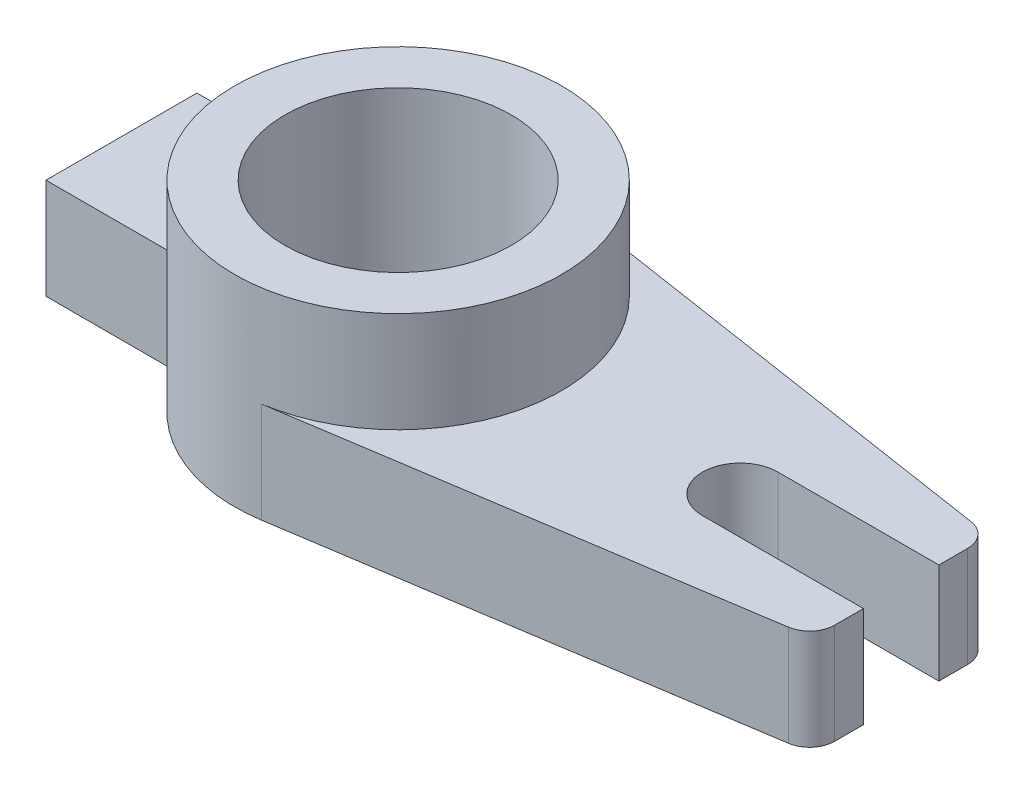
ISO-10303-21;
HEADER;
FILE_DESCRIPTION(('STEP AP214'),'2;1');
FILE_NAME('part.step','',(''),(''),'','','');
FILE_SCHEMA(('AUTOMOTIVE_DESIGN { 1 0 10303 214 1 1 1 1 }'));
ENDSEC;
DATA;
#1=APPLICATION_CONTEXT('core data for automotive mechanical design processes');
#2=APPLICATION_PROTOCOL_DEFINITION('international standard','automotive_design',2000,#1);
#3=PRODUCT_CONTEXT('',#1,'mechanical');
#4=PRODUCT('Part','Part','',(#3));
#5=PRODUCT_RELATED_PRODUCT_CATEGORY('part','',(#4));
#6=PRODUCT_DEFINITION_FORMATION('','',#4);
#7=PRODUCT_DEFINITION_CONTEXT('part definition',#1,'design');
#8=PRODUCT_DEFINITION('design','',#6,#7);
#9=PRODUCT_DEFINITION_SHAPE('','',#8);
#10=(LENGTH_UNIT() NAMED_UNIT(*) SI_UNIT(.MILLI.,.METRE.));
#11=(NAMED_UNIT(*) PLANE_ANGLE_UNIT() SI_UNIT($,.RADIAN.));
#12=(NAMED_UNIT(*) SI_UNIT($,.STERADIAN.) SOLID_ANGLE_UNIT());
#13=UNCERTAINTY_MEASURE_WITH_UNIT(LENGTH_MEASURE(1.E-05),#10,'distance_accuracy_value','');
#14=(GEOMETRIC_REPRESENTATION_CONTEXT(3) GLOBAL_UNCERTAINTY_ASSIGNED_CONTEXT((#13)) GLOBAL_UNIT_ASSIGNED_CONTEXT((#10,
#11,#12)) REPRESENTATION_CONTEXT('',''));
#15=CARTESIAN_POINT('',(0.,0.,0.));
#16=DIRECTION('',(0.,0.,1.));
#17=DIRECTION('',(1.,0.,0.));
#18=AXIS2_PLACEMENT_3D('',#15,#16,#17);
#19=CARTESIAN_POINT('',(0.,20.,0.));
#20=DIRECTION('',(0.,1.,0.));
#21=DIRECTION('',(0.,0.,1.));
#22=AXIS2_PLACEMENT_3D('',#19,#20,#21);
#23=PLANE('',#22);
#24=DIRECTION('',(1.,0.,0.));
#25=VECTOR('',#24,1.);
#26=CARTESIAN_POINT('',(0.,20.,15.));
#27=LINE('',#26,#25);
#28=CARTESIAN_POINT('',(-55.,20.,15.));
#29=VERTEX_POINT('',#28);
#30=CARTESIAN_POINT('',(-28.831406486677,20.,15.));
#31=VERTEX_POINT('',#30);
#32=EDGE_CURVE('E164',#29,#31,#27,.T.);
#33=ORIENTED_EDGE('',*,*,#32,.T.);
#34=CARTESIAN_POINT('',(0.,20.,0.));
#35=DIRECTION('',(0.,1.,0.));
#36=DIRECTION('',(0.,0.,1.));
#37=AXIS2_PLACEMENT_3D('',#34,#35,#36);
#38=CIRCLE('',#37,32.5);
#39=CARTESIAN_POINT('',(-28.831406486677,20.,-15.));
#40=VERTEX_POINT('',#39);
#41=EDGE_CURVE('E11',#31,#40,#38,.F.);
#42=ORIENTED_EDGE('',*,*,#41,.T.);
#43=DIRECTION('',(1.,0.,0.));
#44=VECTOR('',#43,1.);
#45=CARTESIAN_POINT('',(0.,20.,-15.));
#46=LINE('',#45,#44);
#47=CARTESIAN_POINT('',(-55.,20.,-15.));
#48=VERTEX_POINT('',#47);
#49=EDGE_CURVE('E270',#48,#40,#46,.T.);
#50=ORIENTED_EDGE('',*,*,#49,.F.);
#51=DIRECTION('',(0.,0.,-1.));
#52=VECTOR('',#51,1.);
#53=CARTESIAN_POINT('',(-55.,20.,0.));
#54=LINE('',#53,#52);
#55=EDGE_CURVE('E269',#29,#48,#54,.T.);
#56=ORIENTED_EDGE('',*,*,#55,.F.);
#57=EDGE_LOOP('',(#33,#42,#50,#56));
#58=FACE_BOUND('',#57,.T.);
#59=ADVANCED_FACE('F43',(#58),#23,.T.);
#60=DIRECTION('',(-0.988375212209647,0.,-0.152034337863312));
#61=VECTOR('',#60,1.);
#62=CARTESIAN_POINT('',(4.94111598055764,20.,-32.1221943968135));
#63=LINE('',#62,#61);
#64=CARTESIAN_POINT('',(95.7601716893166,20.,-18.1521809550725));
#65=VERTEX_POINT('',#64);
#66=CARTESIAN_POINT('',(4.94111598055764,20.,-32.1221943968135));
#67=VERTEX_POINT('',#66);
#68=EDGE_CURVE('E261',#65,#67,#63,.T.);
#69=ORIENTED_EDGE('',*,*,#68,.T.);
#70=CARTESIAN_POINT('',(4.94111598055763,20.,32.1221943968135));
#71=VERTEX_POINT('',#70);
#72=EDGE_CURVE('E50',#67,#71,#38,.F.);
#73=ORIENTED_EDGE('',*,*,#72,.T.);
#74=DIRECTION('',(-0.988375212209647,0.,0.152034337863312));
#75=VECTOR('',#74,1.);
#76=CARTESIAN_POINT('',(4.94111598055764,20.,32.1221943968135));
#77=LINE('',#76,#75);
#78=CARTESIAN_POINT('',(95.7601716893166,20.,18.1521809550725));
#79=VERTEX_POINT('',#78);
#80=EDGE_CURVE('E149',#79,#71,#77,.T.);
#81=ORIENTED_EDGE('',*,*,#80,.F.);
#82=CARTESIAN_POINT('',(95.,20.,13.2103048940243));
#83=DIRECTION('',(0.,1.,0.));
#84=DIRECTION('',(0.,0.,1.));
#85=AXIS2_PLACEMENT_3D('',#82,#83,#84);
#86=CIRCLE('',#85,5.);
#87=CARTESIAN_POINT('',(100.,20.,13.2103048940243));
#88=VERTEX_POINT('',#87);
#89=EDGE_CURVE('E162',#88,#79,#86,.F.);
#90=ORIENTED_EDGE('',*,*,#89,.F.);
#91=DIRECTION('',(0.,0.,1.));
#92=VECTOR('',#91,1.);
#93=CARTESIAN_POINT('',(100.,20.,0.));
#94=LINE('',#93,#92);
#95=CARTESIAN_POINT('',(100.,20.,7.5));
#96=VERTEX_POINT('',#95);
#97=EDGE_CURVE('E169',#96,#88,#94,.T.);
#98=ORIENTED_EDGE('',*,*,#97,.F.);
#99=DIRECTION('',(1.,0.,0.));
#100=VECTOR('',#99,1.);
#101=CARTESIAN_POINT('',(0.,20.,7.5));
#102=LINE('',#101,#100);
#103=CARTESIAN_POINT('',(68.,20.,7.5));
#104=VERTEX_POINT('',#103);
#105=EDGE_CURVE('E209',#104,#96,#102,.T.);
#106=ORIENTED_EDGE('',*,*,#105,.F.);
#107=CARTESIAN_POINT('',(68.,20.,0.));
#108=DIRECTION('',(0.,1.,0.));
#109=DIRECTION('',(0.,0.,1.));
#110=AXIS2_PLACEMENT_3D('',#107,#108,#109);
#111=CIRCLE('',#110,7.5);
#112=CARTESIAN_POINT('',(68.,20.,-7.5));
#113=VERTEX_POINT('',#112);
#114=EDGE_CURVE('E241',#113,#104,#111,.T.);
#115=ORIENTED_EDGE('',*,*,#114,.F.);
#116=DIRECTION('',(1.,0.,0.));
#117=VECTOR('',#116,1.);
#118=CARTESIAN_POINT('',(0.,20.,-7.5));
#119=LINE('',#118,#117);
#120=CARTESIAN_POINT('',(100.,20.,-7.5));
#121=VERTEX_POINT('',#120);
#122=EDGE_CURVE('E259',#113,#121,#119,.T.);
#123=ORIENTED_EDGE('',*,*,#122,.T.);
#124=DIRECTION('',(0.,0.,-1.));
#125=VECTOR('',#124,1.);
#126=CARTESIAN_POINT('',(100.,20.,0.));
#127=LINE('',#126,#125);
#128=CARTESIAN_POINT('',(100.,20.,-13.2103048940243));
#129=VERTEX_POINT('',#128);
#130=EDGE_CURVE('E258',#121,#129,#127,.T.);
#131=ORIENTED_EDGE('',*,*,#130,.T.);
#132=CARTESIAN_POINT('',(95.,20.,-13.2103048940243));
#133=DIRECTION('',(0.,1.,0.));
#134=DIRECTION('',(0.,0.,1.));
#135=AXIS2_PLACEMENT_3D('',#132,#133,#134);
#136=CIRCLE('',#135,5.);
#137=EDGE_CURVE('E256',#129,#65,#136,.T.);
#138=ORIENTED_EDGE('',*,*,#137,.T.);
#139=EDGE_LOOP('',(#69,#73,#81,#90,#98,#106,#115,#123,#131,#138));
#140=FACE_BOUND('',#139,.T.);
#141=ADVANCED_FACE('F161',(#140),#23,.T.);
#142=CARTESIAN_POINT('',(0.,20.,7.5));
#143=DIRECTION('',(0.,0.,-1.));
#144=DIRECTION('',(-1.,0.,0.));
#145=AXIS2_PLACEMENT_3D('',#142,#143,#144);
#146=PLANE('',#145);
#147=DIRECTION('',(1.,0.,0.));
#148=VECTOR('',#147,1.);
#149=CARTESIAN_POINT('',(0.,0.,7.5));
#150=LINE('',#149,#148);
#151=CARTESIAN_POINT('',(68.,0.,7.5));
#152=VERTEX_POINT('',#151);
#153=CARTESIAN_POINT('',(100.,0.,7.5));
#154=VERTEX_POINT('',#153);
#155=EDGE_CURVE('E174',#152,#154,#150,.T.);
#156=ORIENTED_EDGE('',*,*,#155,.F.);
#157=DIRECTION('',(0.,-1.,0.));
#158=VECTOR('',#157,1.);
#159=CARTESIAN_POINT('',(68.,20.,7.5));
#160=LINE('',#159,#158);
#161=EDGE_CURVE('E111',#104,#152,#160,.T.);
#162=ORIENTED_EDGE('',*,*,#161,.F.);
#163=ORIENTED_EDGE('',*,*,#105,.T.);
#164=DIRECTION('',(0.,-1.,0.));
#165=VECTOR('',#164,1.);
#166=CARTESIAN_POINT('',(100.,20.,7.5));
#167=LINE('',#166,#165);
#168=EDGE_CURVE('E58',#96,#154,#167,.T.);
#169=ORIENTED_EDGE('',*,*,#168,.T.);
#170=EDGE_LOOP('',(#156,#162,#163,#169));
#171=FACE_BOUND('',#170,.T.);
#172=ADVANCED_FACE('F44',(#171),#146,.T.);
#173=CARTESIAN_POINT('',(68.,20.,0.));
#174=DIRECTION('',(0.,-1.,0.));
#175=DIRECTION('',(0.,0.,-1.));
#176=AXIS2_PLACEMENT_3D('',#173,#174,#175);
#177=CYLINDRICAL_SURFACE('',#176,7.5);
#178=CARTESIAN_POINT('',(68.,0.,0.));
#179=DIRECTION('',(0.,1.,0.));
#180=DIRECTION('',(0.,0.,1.));
#181=AXIS2_PLACEMENT_3D('',#178,#179,#180);
#182=CIRCLE('',#181,7.5);
#183=CARTESIAN_POINT('',(68.,0.,-7.5));
#184=VERTEX_POINT('',#183);
#185=EDGE_CURVE('E175',#184,#152,#182,.T.);
#186=ORIENTED_EDGE('',*,*,#185,.F.);
#187=DIRECTION('',(0.,-1.,0.));
#188=VECTOR('',#187,1.);
#189=CARTESIAN_POINT('',(68.,20.,-7.5));
#190=LINE('',#189,#188);
#191=EDGE_CURVE('E233',#113,#184,#190,.T.);
#192=ORIENTED_EDGE('',*,*,#191,.F.);
#193=ORIENTED_EDGE('',*,*,#114,.T.);
#194=ORIENTED_EDGE('',*,*,#161,.T.);
#195=EDGE_LOOP('',(#186,#192,#193,#194));
#196=FACE_BOUND('',#195,.T.);
#197=ADVANCED_FACE('F239',(#196),#177,.F.);
#198=CARTESIAN_POINT('',(0.,20.,-7.5));
#199=DIRECTION('',(0.,0.,-1.));
#200=DIRECTION('',(-1.,0.,0.));
#201=AXIS2_PLACEMENT_3D('',#198,#199,#200);
#202=PLANE('',#201);
#203=DIRECTION('',(1.,0.,0.));
#204=VECTOR('',#203,1.);
#205=CARTESIAN_POINT('',(0.,0.,-7.5));
#206=LINE('',#205,#204);
#207=CARTESIAN_POINT('',(100.,0.,-7.5));
#208=VERTEX_POINT('',#207);
#209=EDGE_CURVE('E176',#184,#208,#206,.T.);
#210=ORIENTED_EDGE('',*,*,#209,.T.);
#211=DIRECTION('',(0.,-1.,0.));
#212=VECTOR('',#211,1.);
#213=CARTESIAN_POINT('',(100.,20.,-7.5));
#214=LINE('',#213,#212);
#215=EDGE_CURVE('E235',#121,#208,#214,.T.);
#216=ORIENTED_EDGE('',*,*,#215,.F.);
#217=ORIENTED_EDGE('',*,*,#122,.F.);
#218=ORIENTED_EDGE('',*,*,#191,.T.);
#219=EDGE_LOOP('',(#210,#216,#217,#218));
#220=FACE_BOUND('',#219,.T.);
#221=ADVANCED_FACE('F248',(#220),#202,.F.);
#222=CARTESIAN_POINT('',(100.,20.,0.));
#223=DIRECTION('',(-1.,0.,0.));
#224=DIRECTION('',(0.,0.,1.));
#225=AXIS2_PLACEMENT_3D('',#222,#223,#224);
#226=PLANE('',#225);
#227=DIRECTION('',(0.,0.,-1.));
#228=VECTOR('',#227,1.);
#229=CARTESIAN_POINT('',(100.,0.,0.));
#230=LINE('',#229,#228);
#231=CARTESIAN_POINT('',(100.,0.,-13.2103048940243));
#232=VERTEX_POINT('',#231);
#233=EDGE_CURVE('E182',#208,#232,#230,.T.);
#234=ORIENTED_EDGE('',*,*,#233,.T.);
#235=DIRECTION('',(0.,-1.,0.));
#236=VECTOR('',#235,1.);
#237=CARTESIAN_POINT('',(100.,20.,-13.2103048940243));
#238=LINE('',#237,#236);
#239=EDGE_CURVE('E228',#129,#232,#238,.T.);
#240=ORIENTED_EDGE('',*,*,#239,.F.);
#241=ORIENTED_EDGE('',*,*,#130,.F.);
#242=ORIENTED_EDGE('',*,*,#215,.T.);
#243=EDGE_LOOP('',(#234,#240,#241,#242));
#244=FACE_BOUND('',#243,.T.);
#245=ADVANCED_FACE('F255',(#244),#226,.F.);
#246=CARTESIAN_POINT('',(95.,20.,-13.2103048940243));
#247=DIRECTION('',(0.,-1.,0.));
#248=DIRECTION('',(0.,0.,-1.));
#249=AXIS2_PLACEMENT_3D('',#246,#247,#248);
#250=CYLINDRICAL_SURFACE('',#249,5.);
#251=CARTESIAN_POINT('',(95.,0.,-13.2103048940243));
#252=DIRECTION('',(0.,1.,0.));
#253=DIRECTION('',(0.,0.,1.));
#254=AXIS2_PLACEMENT_3D('',#251,#252,#253);
#255=CIRCLE('',#254,5.);
#256=CARTESIAN_POINT('',(95.7601716893166,0.,-18.1521809550725));
#257=VERTEX_POINT('',#256);
#258=EDGE_CURVE('E181',#232,#257,#255,.T.);
#259=ORIENTED_EDGE('',*,*,#258,.T.);
#260=DIRECTION('',(0.,-1.,0.));
#261=VECTOR('',#260,1.);
#262=CARTESIAN_POINT('',(95.7601716893166,20.,-18.1521809550725));
#263=LINE('',#262,#261);
#264=EDGE_CURVE('E226',#65,#257,#263,.T.);
#265=ORIENTED_EDGE('',*,*,#264,.F.);
#266=ORIENTED_EDGE('',*,*,#137,.F.);
#267=ORIENTED_EDGE('',*,*,#239,.T.);
#268=EDGE_LOOP('',(#259,#265,#266,#267));
#269=FACE_BOUND('',#268,.T.);
#270=ADVANCED_FACE('F300',(#269),#250,.T.);
#271=CARTESIAN_POINT('',(4.94111598055764,20.,-32.1221943968135));
#272=DIRECTION('',(-0.152034337863312,0.,0.988375212209647));
#273=DIRECTION('',(0.988375212209647,0.,0.152034337863312));
#274=AXIS2_PLACEMENT_3D('',#271,#272,#273);
#275=PLANE('',#274);
#276=DIRECTION('',(-0.988375212209647,0.,-0.152034337863312));
#277=VECTOR('',#276,1.);
#278=CARTESIAN_POINT('',(4.94111598055764,0.,-32.1221943968135));
#279=LINE('',#278,#277);
#280=CARTESIAN_POINT('',(4.94111598055764,0.,-32.1221943968135));
#281=VERTEX_POINT('',#280);
#282=EDGE_CURVE('E183',#257,#281,#279,.T.);
#283=ORIENTED_EDGE('',*,*,#282,.T.);
#284=DIRECTION('',(0.,-1.,0.));
#285=VECTOR('',#284,1.);
#286=CARTESIAN_POINT('',(4.94111598055764,20.,-32.1221943968135));
#287=LINE('',#286,#285);
#288=EDGE_CURVE('E224',#67,#281,#287,.T.);
#289=ORIENTED_EDGE('',*,*,#288,.F.);
#290=ORIENTED_EDGE('',*,*,#68,.F.);
#291=ORIENTED_EDGE('',*,*,#264,.T.);
#292=EDGE_LOOP('',(#283,#289,#290,#291));
#293=FACE_BOUND('',#292,.T.);
#294=ADVANCED_FACE('F297',(#293),#275,.F.);
#295=CARTESIAN_POINT('',(0.,20.,-15.));
#296=DIRECTION('',(0.,0.,-1.));
#297=DIRECTION('',(-1.,0.,0.));
#298=AXIS2_PLACEMENT_3D('',#295,#296,#297);
#299=PLANE('',#298);
#300=DIRECTION('',(1.,0.,0.));
#301=VECTOR('',#300,1.);
#302=CARTESIAN_POINT('',(0.,0.,-15.));
#303=LINE('',#302,#301);
#304=CARTESIAN_POINT('',(-55.,0.,-15.));
#305=VERTEX_POINT('',#304);
#306=CARTESIAN_POINT('',(-28.831406486677,0.,-15.));
#307=VERTEX_POINT('',#306);
#308=EDGE_CURVE('E190',#305,#307,#303,.T.);
#309=ORIENTED_EDGE('',*,*,#308,.F.);
#310=DIRECTION('',(0.,-1.,0.));
#311=VECTOR('',#310,1.);
#312=CARTESIAN_POINT('',(-55.,20.,-15.));
#313=LINE('',#312,#311);
#314=EDGE_CURVE('E218',#48,#305,#313,.T.);
#315=ORIENTED_EDGE('',*,*,#314,.F.);
#316=ORIENTED_EDGE('',*,*,#49,.T.);
#317=DIRECTION('',(0.,-1.,0.));
#318=VECTOR('',#317,1.);
#319=CARTESIAN_POINT('',(-28.831406486677,20.,-15.));
#320=LINE('',#319,#318);
#321=EDGE_CURVE('E222',#40,#307,#320,.T.);
#322=ORIENTED_EDGE('',*,*,#321,.T.);
#323=EDGE_LOOP('',(#309,#315,#316,#322));
#324=FACE_BOUND('',#323,.T.);
#325=ADVANCED_FACE('F286',(#324),#299,.T.);
#326=CARTESIAN_POINT('',(-55.,20.,0.));
#327=DIRECTION('',(-1.,0.,0.));
#328=DIRECTION('',(0.,0.,1.));
#329=AXIS2_PLACEMENT_3D('',#326,#327,#328);
#330=PLANE('',#329);
#331=DIRECTION('',(0.,0.,-1.));
#332=VECTOR('',#331,1.);
#333=CARTESIAN_POINT('',(-55.,0.,0.));
#334=LINE('',#333,#332);
#335=CARTESIAN_POINT('',(-55.,0.,15.));
#336=VERTEX_POINT('',#335);
#337=EDGE_CURVE('E194',#336,#305,#334,.T.);
#338=ORIENTED_EDGE('',*,*,#337,.F.);
#339=DIRECTION('',(0.,-1.,0.));
#340=VECTOR('',#339,1.);
#341=CARTESIAN_POINT('',(-55.,20.,15.));
#342=LINE('',#341,#340);
#343=EDGE_CURVE('E220',#29,#336,#342,.T.);
#344=ORIENTED_EDGE('',*,*,#343,.F.);
#345=ORIENTED_EDGE('',*,*,#55,.T.);
#346=ORIENTED_EDGE('',*,*,#314,.T.);
#347=EDGE_LOOP('',(#338,#344,#345,#346));
#348=FACE_BOUND('',#347,.T.);
#349=ADVANCED_FACE('F295',(#348),#330,.T.);
#350=CARTESIAN_POINT('',(0.,20.,15.));
#351=DIRECTION('',(0.,0.,-1.));
#352=DIRECTION('',(-1.,0.,0.));
#353=AXIS2_PLACEMENT_3D('',#350,#351,#352);
#354=PLANE('',#353);
#355=DIRECTION('',(1.,0.,0.));
#356=VECTOR('',#355,1.);
#357=CARTESIAN_POINT('',(0.,0.,15.));
#358=LINE('',#357,#356);
#359=CARTESIAN_POINT('',(-28.831406486677,0.,15.));
#360=VERTEX_POINT('',#359);
#361=EDGE_CURVE('E198',#336,#360,#358,.T.);
#362=ORIENTED_EDGE('',*,*,#361,.T.);
#363=DIRECTION('',(0.,-1.,0.));
#364=VECTOR('',#363,1.);
#365=CARTESIAN_POINT('',(-28.831406486677,20.,15.));
#366=LINE('',#365,#364);
#367=EDGE_CURVE('E212',#31,#360,#366,.T.);
#368=ORIENTED_EDGE('',*,*,#367,.F.);
#369=ORIENTED_EDGE('',*,*,#32,.F.);
#370=ORIENTED_EDGE('',*,*,#343,.T.);
#371=EDGE_LOOP('',(#362,#368,#369,#370));
#372=FACE_BOUND('',#371,.T.);
#373=ADVANCED_FACE('F278',(#372),#354,.F.);
#374=CARTESIAN_POINT('',(0.,20.,0.));
#375=DIRECTION('',(0.,-1.,0.));
#376=DIRECTION('',(0.,0.,-1.));
#377=AXIS2_PLACEMENT_3D('',#374,#375,#376);
#378=CYLINDRICAL_SURFACE('',#377,32.5);
#379=CARTESIAN_POINT('',(0.,0.,0.));
#380=DIRECTION('',(0.,1.,0.));
#381=DIRECTION('',(0.,0.,1.));
#382=AXIS2_PLACEMENT_3D('',#379,#380,#381);
#383=CIRCLE('',#382,32.5);
#384=CARTESIAN_POINT('',(4.94111598055764,0.,32.1221943968135));
#385=VERTEX_POINT('',#384);
#386=EDGE_CURVE('E196',#360,#385,#383,.T.);
#387=ORIENTED_EDGE('',*,*,#386,.T.);
#388=DIRECTION('',(0.,-1.,0.));
#389=VECTOR('',#388,1.);
#390=CARTESIAN_POINT('',(4.94111598055764,20.,32.1221943968135));
#391=LINE('',#390,#389);
#392=EDGE_CURVE('E156',#71,#385,#391,.T.);
#393=ORIENTED_EDGE('',*,*,#392,.F.);
#394=ORIENTED_EDGE('',*,*,#72,.F.);
#395=ORIENTED_EDGE('',*,*,#288,.T.);
#396=CARTESIAN_POINT('',(0.,0.,0.));
#397=DIRECTION('',(0.,1.,0.));
#398=DIRECTION('',(0.,0.,1.));
#399=AXIS2_PLACEMENT_3D('',#396,#397,#398);
#400=CIRCLE('',#399,32.5);
#401=EDGE_CURVE('E187',#281,#307,#400,.T.);
#402=ORIENTED_EDGE('',*,*,#401,.T.);
#403=ORIENTED_EDGE('',*,*,#321,.F.);
#404=ORIENTED_EDGE('',*,*,#41,.F.);
#405=ORIENTED_EDGE('',*,*,#367,.T.);
#406=EDGE_LOOP('',(#387,#393,#394,#395,#402,#403,#404,#405));
#407=FACE_BOUND('',#406,.T.);
#408=CARTESIAN_POINT('',(0.,40.,0.));
#409=DIRECTION('',(0.,1.,0.));
#410=DIRECTION('',(0.,0.,1.));
#411=AXIS2_PLACEMENT_3D('',#408,#409,#410);
#412=CIRCLE('',#411,32.5);
#413=CARTESIAN_POINT('',(0.,40.,32.5));
#414=VERTEX_POINT('',#413);
#415=EDGE_CURVE('E177',#414,#414,#412,.T.);
#416=ORIENTED_EDGE('',*,*,#415,.F.);
#417=EDGE_LOOP('',(#416));
#418=FACE_BOUND('',#417,.T.);
#419=ADVANCED_FACE('F283',(#407,#418),#378,.T.);
#420=CARTESIAN_POINT('',(4.94111598055764,20.,32.1221943968135));
#421=DIRECTION('',(0.152034337863312,0.,0.988375212209647));
#422=DIRECTION('',(0.988375212209647,0.,-0.152034337863312));
#423=AXIS2_PLACEMENT_3D('',#420,#421,#422);
#424=PLANE('',#423);
#425=DIRECTION('',(-0.988375212209647,0.,0.152034337863312));
#426=VECTOR('',#425,1.);
#427=CARTESIAN_POINT('',(4.94111598055764,0.,32.1221943968135));
#428=LINE('',#427,#426);
#429=CARTESIAN_POINT('',(95.7601716893166,0.,18.1521809550725));
#430=VERTEX_POINT('',#429);
#431=EDGE_CURVE('E155',#430,#385,#428,.T.);
#432=ORIENTED_EDGE('',*,*,#431,.F.);
#433=DIRECTION('',(0.,-1.,0.));
#434=VECTOR('',#433,1.);
#435=CARTESIAN_POINT('',(95.7601716893166,20.,18.1521809550725));
#436=LINE('',#435,#434);
#437=EDGE_CURVE('E148',#79,#430,#436,.T.);
#438=ORIENTED_EDGE('',*,*,#437,.F.);
#439=ORIENTED_EDGE('',*,*,#80,.T.);
#440=ORIENTED_EDGE('',*,*,#392,.T.);
#441=EDGE_LOOP('',(#432,#438,#439,#440));
#442=FACE_BOUND('',#441,.T.);
#443=ADVANCED_FACE('F146',(#442),#424,.T.);
#444=CARTESIAN_POINT('',(95.,20.,13.2103048940243));
#445=DIRECTION('',(0.,-1.,0.));
#446=DIRECTION('',(0.,0.,-1.));
#447=AXIS2_PLACEMENT_3D('',#444,#445,#446);
#448=CYLINDRICAL_SURFACE('',#447,5.);
#449=CARTESIAN_POINT('',(95.,0.,13.2103048940243));
#450=DIRECTION('',(0.,1.,0.));
#451=DIRECTION('',(0.,0.,1.));
#452=AXIS2_PLACEMENT_3D('',#449,#450,#451);
#453=CIRCLE('',#452,5.);
#454=CARTESIAN_POINT('',(100.,0.,13.2103048940243));
#455=VERTEX_POINT('',#454);
#456=EDGE_CURVE('E205',#455,#430,#453,.F.);
#457=ORIENTED_EDGE('',*,*,#456,.F.);
#458=DIRECTION('',(0.,-1.,0.));
#459=VECTOR('',#458,1.);
#460=CARTESIAN_POINT('',(100.,20.,13.2103048940243));
#461=LINE('',#460,#459);
#462=EDGE_CURVE('E104',#88,#455,#461,.T.);
#463=ORIENTED_EDGE('',*,*,#462,.F.);
#464=ORIENTED_EDGE('',*,*,#89,.T.);
#465=ORIENTED_EDGE('',*,*,#437,.T.);
#466=EDGE_LOOP('',(#457,#463,#464,#465));
#467=FACE_BOUND('',#466,.T.);
#468=ADVANCED_FACE('F170',(#467),#448,.T.);
#469=CARTESIAN_POINT('',(100.,20.,0.));
#470=DIRECTION('',(1.,0.,0.));
#471=DIRECTION('',(0.,0.,-1.));
#472=AXIS2_PLACEMENT_3D('',#469,#470,#471);
#473=PLANE('',#472);
#474=DIRECTION('',(0.,0.,1.));
#475=VECTOR('',#474,1.);
#476=CARTESIAN_POINT('',(100.,0.,0.));
#477=LINE('',#476,#475);
#478=EDGE_CURVE('E204',#154,#455,#477,.T.);
#479=ORIENTED_EDGE('',*,*,#478,.F.);
#480=ORIENTED_EDGE('',*,*,#168,.F.);
#481=ORIENTED_EDGE('',*,*,#97,.T.);
#482=ORIENTED_EDGE('',*,*,#462,.T.);
#483=EDGE_LOOP('',(#479,#480,#481,#482));
#484=FACE_BOUND('',#483,.T.);
#485=ADVANCED_FACE('F322',(#484),#473,.T.);
#486=CARTESIAN_POINT('',(0.,20.,0.));
#487=DIRECTION('',(0.,-1.,0.));
#488=DIRECTION('',(0.,0.,-1.));
#489=AXIS2_PLACEMENT_3D('',#486,#487,#488);
#490=CYLINDRICAL_SURFACE('',#489,22.5);
#491=CARTESIAN_POINT('',(0.,0.,0.));
#492=DIRECTION('',(0.,1.,0.));
#493=DIRECTION('',(0.,0.,1.));
#494=AXIS2_PLACEMENT_3D('',#491,#492,#493);
#495=CIRCLE('',#494,22.5);
#496=CARTESIAN_POINT('',(0.,0.,22.5));
#497=VERTEX_POINT('',#496);
#498=EDGE_CURVE('E210',#497,#497,#495,.T.);
#499=ORIENTED_EDGE('',*,*,#498,.F.);
#500=EDGE_LOOP('',(#499));
#501=FACE_BOUND('',#500,.T.);
#502=CARTESIAN_POINT('',(0.,40.,0.));
#503=DIRECTION('',(0.,1.,0.));
#504=DIRECTION('',(0.,0.,1.));
#505=AXIS2_PLACEMENT_3D('',#502,#503,#504);
#506=CIRCLE('',#505,22.5);
#507=CARTESIAN_POINT('',(0.,40.,22.5));
#508=VERTEX_POINT('',#507);
#509=EDGE_CURVE('E510',#508,#508,#506,.T.);
#510=ORIENTED_EDGE('',*,*,#509,.T.);
#511=EDGE_LOOP('',(#510));
#512=FACE_BOUND('',#511,.T.);
#513=ADVANCED_FACE('F321',(#501,#512),#490,.F.);
#514=CARTESIAN_POINT('',(0.,0.,0.));
#515=DIRECTION('',(0.,1.,0.));
#516=DIRECTION('',(0.,0.,1.));
#517=AXIS2_PLACEMENT_3D('',#514,#515,#516);
#518=PLANE('',#517);
#519=ORIENTED_EDGE('',*,*,#308,.T.);
#520=ORIENTED_EDGE('',*,*,#401,.F.);
#521=ORIENTED_EDGE('',*,*,#282,.F.);
#522=ORIENTED_EDGE('',*,*,#258,.F.);
#523=ORIENTED_EDGE('',*,*,#233,.F.);
#524=ORIENTED_EDGE('',*,*,#209,.F.);
#525=ORIENTED_EDGE('',*,*,#185,.T.);
#526=ORIENTED_EDGE('',*,*,#155,.T.);
#527=ORIENTED_EDGE('',*,*,#478,.T.);
#528=ORIENTED_EDGE('',*,*,#456,.T.);
#529=ORIENTED_EDGE('',*,*,#431,.T.);
#530=ORIENTED_EDGE('',*,*,#386,.F.);
#531=ORIENTED_EDGE('',*,*,#361,.F.);
#532=ORIENTED_EDGE('',*,*,#337,.T.);
#533=EDGE_LOOP('',(#519,#520,#521,#522,#523,#524,#525,#526,#527,#528,#529,#530,#531,#532));
#534=FACE_BOUND('',#533,.T.);
#535=ORIENTED_EDGE('',*,*,#498,.T.);
#536=EDGE_LOOP('',(#535));
#537=FACE_BOUND('',#536,.T.);
#538=ADVANCED_FACE('F243',(#534,#537),#518,.F.);
#539=CARTESIAN_POINT('',(0.,40.,0.));
#540=DIRECTION('',(0.,1.,0.));
#541=DIRECTION('',(0.,0.,1.));
#542=AXIS2_PLACEMENT_3D('',#539,#540,#541);
#543=PLANE('',#542);
#544=ORIENTED_EDGE('',*,*,#509,.F.);
#545=EDGE_LOOP('',(#544));
#546=FACE_BOUND('',#545,.T.);
#547=ORIENTED_EDGE('',*,*,#415,.T.);
#548=EDGE_LOOP('',(#547));
#549=FACE_BOUND('',#548,.T.);
#550=ADVANCED_FACE('F318',(#546,#549),#543,.T.);
#551=CLOSED_SHELL('',(#59,#141,#172,#197,#221,#245,#270,#294,#325,#349,#373,#419,#443,#468,#485,
#513,#538,#550));
#552=MANIFOLD_SOLID_BREP('B2',#551);
#553=ADVANCED_BREP_SHAPE_REPRESENTATION('',(#18,#552),#14);
#554=SHAPE_DEFINITION_REPRESENTATION(#9,#553);
ENDSEC;
END-ISO-10303-21;
